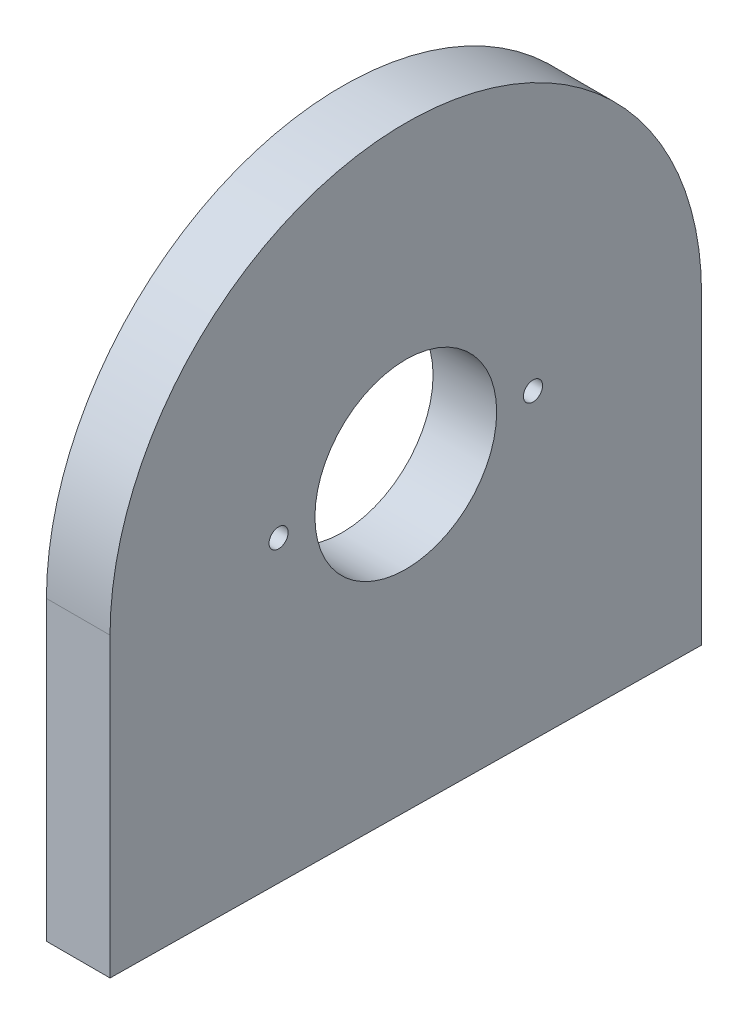
ISO-10303-21;
HEADER;
FILE_DESCRIPTION(('STEP AP214'),'2;1');
FILE_NAME('part.step','',(''),(''),'','','');
FILE_SCHEMA(('AUTOMOTIVE_DESIGN { 1 0 10303 214 1 1 1 1 }'));
ENDSEC;
DATA;
#1=APPLICATION_CONTEXT('core data for automotive mechanical design processes');
#2=APPLICATION_PROTOCOL_DEFINITION('international standard','automotive_design',2000,#1);
#3=PRODUCT_CONTEXT('',#1,'mechanical');
#4=PRODUCT('Part','Part','',(#3));
#5=PRODUCT_RELATED_PRODUCT_CATEGORY('part','',(#4));
#6=PRODUCT_DEFINITION_FORMATION('','',#4);
#7=PRODUCT_DEFINITION_CONTEXT('part definition',#1,'design');
#8=PRODUCT_DEFINITION('design','',#6,#7);
#9=PRODUCT_DEFINITION_SHAPE('','',#8);
#10=(LENGTH_UNIT() NAMED_UNIT(*) SI_UNIT(.MILLI.,.METRE.));
#11=(NAMED_UNIT(*) PLANE_ANGLE_UNIT() SI_UNIT($,.RADIAN.));
#12=(NAMED_UNIT(*) SI_UNIT($,.STERADIAN.) SOLID_ANGLE_UNIT());
#13=UNCERTAINTY_MEASURE_WITH_UNIT(LENGTH_MEASURE(1.E-05),#10,'distance_accuracy_value','');
#14=(GEOMETRIC_REPRESENTATION_CONTEXT(3) GLOBAL_UNCERTAINTY_ASSIGNED_CONTEXT((#13)) GLOBAL_UNIT_ASSIGNED_CONTEXT((#10,
#11,#12)) REPRESENTATION_CONTEXT('',''));
#15=CARTESIAN_POINT('',(0.,0.,0.));
#16=DIRECTION('',(0.,0.,1.));
#17=DIRECTION('',(1.,0.,0.));
#18=AXIS2_PLACEMENT_3D('',#15,#16,#17);
#19=CARTESIAN_POINT('',(10.,0.,0.));
#20=DIRECTION('',(-1.,0.,0.));
#21=DIRECTION('',(0.,0.,1.));
#22=AXIS2_PLACEMENT_3D('',#19,#20,#21);
#23=PLANE('',#22);
#24=CARTESIAN_POINT('',(10.,0.,0.));
#25=DIRECTION('',(1.,0.,0.));
#26=DIRECTION('',(0.,0.,1.));
#27=AXIS2_PLACEMENT_3D('',#24,#25,#26);
#28=CIRCLE('',#27,46.5);
#29=CARTESIAN_POINT('',(10.,0.,-46.5));
#30=VERTEX_POINT('',#29);
#31=CARTESIAN_POINT('',(10.,0.,46.5));
#32=VERTEX_POINT('',#31);
#33=EDGE_CURVE('E86',#30,#32,#28,.T.);
#34=ORIENTED_EDGE('',*,*,#33,.T.);
#35=DIRECTION('',(0.,-1.,0.));
#36=VECTOR('',#35,1.);
#37=CARTESIAN_POINT('',(10.,0.,46.5));
#38=LINE('',#37,#36);
#39=CARTESIAN_POINT('',(10.,-46.680661447928,46.5));
#40=VERTEX_POINT('',#39);
#41=EDGE_CURVE('E81',#32,#40,#38,.T.);
#42=ORIENTED_EDGE('',*,*,#41,.T.);
#43=DIRECTION('',(0.,-0.0126636879867013,-0.999919812288253));
#44=VECTOR('',#43,1.);
#45=CARTESIAN_POINT('',(10.,-46.680661447928,46.5));
#46=LINE('',#45,#44);
#47=CARTESIAN_POINT('',(10.,-47.8584788771757,-46.5));
#48=VERTEX_POINT('',#47);
#49=EDGE_CURVE('E84',#40,#48,#46,.T.);
#50=ORIENTED_EDGE('',*,*,#49,.T.);
#51=DIRECTION('',(0.,1.,0.));
#52=VECTOR('',#51,1.);
#53=CARTESIAN_POINT('',(10.,-47.8584788771757,-46.5));
#54=LINE('',#53,#52);
#55=EDGE_CURVE('E51',#48,#30,#54,.T.);
#56=ORIENTED_EDGE('',*,*,#55,.T.);
#57=EDGE_LOOP('',(#34,#42,#50,#56));
#58=FACE_BOUND('',#57,.T.);
#59=CARTESIAN_POINT('',(10.,0.,0.));
#60=DIRECTION('',(1.,0.,0.));
#61=DIRECTION('',(0.,0.,-1.));
#62=AXIS2_PLACEMENT_3D('',#59,#60,#61);
#63=CIRCLE('',#62,14.2875);
#64=CARTESIAN_POINT('',(10.,0.,-14.2875));
#65=VERTEX_POINT('',#64);
#66=EDGE_CURVE('E101',#65,#65,#63,.T.);
#67=ORIENTED_EDGE('',*,*,#66,.F.);
#68=EDGE_LOOP('',(#67));
#69=FACE_BOUND('',#68,.T.);
#70=CARTESIAN_POINT('',(10.,0.,-20.));
#71=DIRECTION('',(1.,0.,0.));
#72=DIRECTION('',(0.,0.,-1.));
#73=AXIS2_PLACEMENT_3D('',#70,#71,#72);
#74=CIRCLE('',#73,1.5);
#75=CARTESIAN_POINT('',(10.,0.,-21.5));
#76=VERTEX_POINT('',#75);
#77=EDGE_CURVE('E116',#76,#76,#74,.T.);
#78=ORIENTED_EDGE('',*,*,#77,.F.);
#79=EDGE_LOOP('',(#78));
#80=FACE_BOUND('',#79,.T.);
#81=CARTESIAN_POINT('',(10.,0.,20.));
#82=DIRECTION('',(1.,0.,0.));
#83=DIRECTION('',(0.,0.,-1.));
#84=AXIS2_PLACEMENT_3D('',#81,#82,#83);
#85=CIRCLE('',#84,1.5);
#86=CARTESIAN_POINT('',(10.,0.,18.5));
#87=VERTEX_POINT('',#86);
#88=EDGE_CURVE('E122',#87,#87,#85,.T.);
#89=ORIENTED_EDGE('',*,*,#88,.F.);
#90=EDGE_LOOP('',(#89));
#91=FACE_BOUND('',#90,.T.);
#92=ADVANCED_FACE('F34',(#58,#69,#80,#91),#23,.F.);
#93=CARTESIAN_POINT('',(0.,0.,0.));
#94=DIRECTION('',(-1.,0.,0.));
#95=DIRECTION('',(0.,0.,1.));
#96=AXIS2_PLACEMENT_3D('',#93,#94,#95);
#97=PLANE('',#96);
#98=CARTESIAN_POINT('',(0.,0.,-20.));
#99=DIRECTION('',(1.,0.,0.));
#100=DIRECTION('',(0.,0.,-1.));
#101=AXIS2_PLACEMENT_3D('',#98,#99,#100);
#102=CIRCLE('',#101,1.5);
#103=CARTESIAN_POINT('',(0.,0.,-21.5));
#104=VERTEX_POINT('',#103);
#105=EDGE_CURVE('E119',#104,#104,#102,.T.);
#106=ORIENTED_EDGE('',*,*,#105,.T.);
#107=EDGE_LOOP('',(#106));
#108=FACE_BOUND('',#107,.T.);
#109=CARTESIAN_POINT('',(0.,0.,0.));
#110=DIRECTION('',(1.,0.,0.));
#111=DIRECTION('',(0.,0.,1.));
#112=AXIS2_PLACEMENT_3D('',#109,#110,#111);
#113=CIRCLE('',#112,46.5);
#114=CARTESIAN_POINT('',(0.,0.,-46.5));
#115=VERTEX_POINT('',#114);
#116=CARTESIAN_POINT('',(0.,0.,46.5));
#117=VERTEX_POINT('',#116);
#118=EDGE_CURVE('E98',#115,#117,#113,.T.);
#119=ORIENTED_EDGE('',*,*,#118,.F.);
#120=DIRECTION('',(0.,1.,0.));
#121=VECTOR('',#120,1.);
#122=CARTESIAN_POINT('',(0.,-47.8584788771757,-46.5));
#123=LINE('',#122,#121);
#124=CARTESIAN_POINT('',(0.,-47.8584788771757,-46.5));
#125=VERTEX_POINT('',#124);
#126=EDGE_CURVE('E74',#125,#115,#123,.T.);
#127=ORIENTED_EDGE('',*,*,#126,.F.);
#128=DIRECTION('',(0.,-0.0126636879867013,-0.999919812288253));
#129=VECTOR('',#128,1.);
#130=CARTESIAN_POINT('',(0.,-46.680661447928,46.5));
#131=LINE('',#130,#129);
#132=CARTESIAN_POINT('',(0.,-46.680661447928,46.5));
#133=VERTEX_POINT('',#132);
#134=EDGE_CURVE('E68',#133,#125,#131,.T.);
#135=ORIENTED_EDGE('',*,*,#134,.F.);
#136=DIRECTION('',(0.,-1.,0.));
#137=VECTOR('',#136,1.);
#138=CARTESIAN_POINT('',(0.,0.,46.5));
#139=LINE('',#138,#137);
#140=EDGE_CURVE('E90',#117,#133,#139,.T.);
#141=ORIENTED_EDGE('',*,*,#140,.F.);
#142=EDGE_LOOP('',(#119,#127,#135,#141));
#143=FACE_BOUND('',#142,.T.);
#144=CARTESIAN_POINT('',(0.,0.,0.));
#145=DIRECTION('',(1.,0.,0.));
#146=DIRECTION('',(0.,0.,-1.));
#147=AXIS2_PLACEMENT_3D('',#144,#145,#146);
#148=CIRCLE('',#147,14.2875);
#149=CARTESIAN_POINT('',(0.,0.,-14.2875));
#150=VERTEX_POINT('',#149);
#151=EDGE_CURVE('E113',#150,#150,#148,.T.);
#152=ORIENTED_EDGE('',*,*,#151,.T.);
#153=EDGE_LOOP('',(#152));
#154=FACE_BOUND('',#153,.T.);
#155=CARTESIAN_POINT('',(0.,0.,20.));
#156=DIRECTION('',(1.,0.,0.));
#157=DIRECTION('',(0.,0.,-1.));
#158=AXIS2_PLACEMENT_3D('',#155,#156,#157);
#159=CIRCLE('',#158,1.5);
#160=CARTESIAN_POINT('',(0.,0.,18.5));
#161=VERTEX_POINT('',#160);
#162=EDGE_CURVE('E125',#161,#161,#159,.T.);
#163=ORIENTED_EDGE('',*,*,#162,.T.);
#164=EDGE_LOOP('',(#163));
#165=FACE_BOUND('',#164,.T.);
#166=ADVANCED_FACE('F109',(#108,#143,#154,#165),#97,.T.);
#167=CARTESIAN_POINT('',(10.,0.,0.));
#168=DIRECTION('',(-1.,0.,0.));
#169=DIRECTION('',(0.,0.,1.));
#170=AXIS2_PLACEMENT_3D('',#167,#168,#169);
#171=CYLINDRICAL_SURFACE('',#170,46.5);
#172=ORIENTED_EDGE('',*,*,#118,.T.);
#173=DIRECTION('',(-1.,0.,0.));
#174=VECTOR('',#173,1.);
#175=CARTESIAN_POINT('',(10.,0.,46.5));
#176=LINE('',#175,#174);
#177=EDGE_CURVE('E11',#32,#117,#176,.T.);
#178=ORIENTED_EDGE('',*,*,#177,.F.);
#179=ORIENTED_EDGE('',*,*,#33,.F.);
#180=DIRECTION('',(-1.,0.,0.));
#181=VECTOR('',#180,1.);
#182=CARTESIAN_POINT('',(10.,0.,-46.5));
#183=LINE('',#182,#181);
#184=EDGE_CURVE('E94',#30,#115,#183,.T.);
#185=ORIENTED_EDGE('',*,*,#184,.T.);
#186=EDGE_LOOP('',(#172,#178,#179,#185));
#187=FACE_BOUND('',#186,.T.);
#188=ADVANCED_FACE('F36',(#187),#171,.T.);
#189=CARTESIAN_POINT('',(10.,0.,46.5));
#190=DIRECTION('',(0.,0.,-1.));
#191=DIRECTION('',(0.,1.,0.));
#192=AXIS2_PLACEMENT_3D('',#189,#190,#191);
#193=PLANE('',#192);
#194=ORIENTED_EDGE('',*,*,#140,.T.);
#195=DIRECTION('',(-1.,0.,0.));
#196=VECTOR('',#195,1.);
#197=CARTESIAN_POINT('',(10.,-46.680661447928,46.5));
#198=LINE('',#197,#196);
#199=EDGE_CURVE('E43',#40,#133,#198,.T.);
#200=ORIENTED_EDGE('',*,*,#199,.F.);
#201=ORIENTED_EDGE('',*,*,#41,.F.);
#202=ORIENTED_EDGE('',*,*,#177,.T.);
#203=EDGE_LOOP('',(#194,#200,#201,#202));
#204=FACE_BOUND('',#203,.T.);
#205=ADVANCED_FACE('F89',(#204),#193,.F.);
#206=CARTESIAN_POINT('',(10.,-46.680661447928,46.5));
#207=DIRECTION('',(0.,0.999919812288253,-0.0126636879867013));
#208=DIRECTION('',(0.,0.0126636879867013,0.999919812288253));
#209=AXIS2_PLACEMENT_3D('',#206,#207,#208);
#210=PLANE('',#209);
#211=ORIENTED_EDGE('',*,*,#134,.T.);
#212=DIRECTION('',(-1.,0.,0.));
#213=VECTOR('',#212,1.);
#214=CARTESIAN_POINT('',(10.,-47.8584788771757,-46.5));
#215=LINE('',#214,#213);
#216=EDGE_CURVE('E91',#48,#125,#215,.T.);
#217=ORIENTED_EDGE('',*,*,#216,.F.);
#218=ORIENTED_EDGE('',*,*,#49,.F.);
#219=ORIENTED_EDGE('',*,*,#199,.T.);
#220=EDGE_LOOP('',(#211,#217,#218,#219));
#221=FACE_BOUND('',#220,.T.);
#222=ADVANCED_FACE('F92',(#221),#210,.F.);
#223=CARTESIAN_POINT('',(10.,-47.8584788771757,-46.5));
#224=DIRECTION('',(0.,0.,1.));
#225=DIRECTION('',(1.,0.,0.));
#226=AXIS2_PLACEMENT_3D('',#223,#224,#225);
#227=PLANE('',#226);
#228=ORIENTED_EDGE('',*,*,#126,.T.);
#229=ORIENTED_EDGE('',*,*,#184,.F.);
#230=ORIENTED_EDGE('',*,*,#55,.F.);
#231=ORIENTED_EDGE('',*,*,#216,.T.);
#232=EDGE_LOOP('',(#228,#229,#230,#231));
#233=FACE_BOUND('',#232,.T.);
#234=ADVANCED_FACE('F106',(#233),#227,.F.);
#235=CARTESIAN_POINT('',(10.,0.,0.));
#236=DIRECTION('',(-1.,0.,0.));
#237=DIRECTION('',(0.,0.,1.));
#238=AXIS2_PLACEMENT_3D('',#235,#236,#237);
#239=CYLINDRICAL_SURFACE('',#238,14.2875);
#240=ORIENTED_EDGE('',*,*,#66,.T.);
#241=EDGE_LOOP('',(#240));
#242=FACE_BOUND('',#241,.T.);
#243=ORIENTED_EDGE('',*,*,#151,.F.);
#244=EDGE_LOOP('',(#243));
#245=FACE_BOUND('',#244,.T.);
#246=ADVANCED_FACE('F142',(#242,#245),#239,.F.);
#247=CARTESIAN_POINT('',(10.,0.,-20.));
#248=DIRECTION('',(-1.,0.,0.));
#249=DIRECTION('',(0.,0.,1.));
#250=AXIS2_PLACEMENT_3D('',#247,#248,#249);
#251=CYLINDRICAL_SURFACE('',#250,1.5);
#252=ORIENTED_EDGE('',*,*,#77,.T.);
#253=EDGE_LOOP('',(#252));
#254=FACE_BOUND('',#253,.T.);
#255=ORIENTED_EDGE('',*,*,#105,.F.);
#256=EDGE_LOOP('',(#255));
#257=FACE_BOUND('',#256,.T.);
#258=ADVANCED_FACE('F188',(#254,#257),#251,.F.);
#259=CARTESIAN_POINT('',(10.,0.,20.));
#260=DIRECTION('',(-1.,0.,0.));
#261=DIRECTION('',(0.,0.,1.));
#262=AXIS2_PLACEMENT_3D('',#259,#260,#261);
#263=CYLINDRICAL_SURFACE('',#262,1.5);
#264=ORIENTED_EDGE('',*,*,#88,.T.);
#265=EDGE_LOOP('',(#264));
#266=FACE_BOUND('',#265,.T.);
#267=ORIENTED_EDGE('',*,*,#162,.F.);
#268=EDGE_LOOP('',(#267));
#269=FACE_BOUND('',#268,.T.);
#270=ADVANCED_FACE('F131',(#266,#269),#263,.F.);
#271=CLOSED_SHELL('',(#92,#166,#188,#205,#222,#234,#246,#258,#270));
#272=MANIFOLD_SOLID_BREP('B2',#271);
#273=ADVANCED_BREP_SHAPE_REPRESENTATION('',(#18,#272),#14);
#274=SHAPE_DEFINITION_REPRESENTATION(#9,#273);
ENDSEC;
END-ISO-10303-21;
